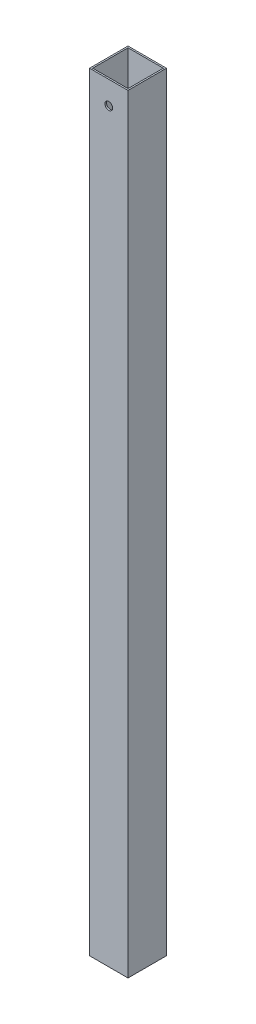
ISO-10303-21;
HEADER;
FILE_DESCRIPTION(('STEP AP214'),'2;1');
FILE_NAME('part.step','',(''),(''),'','','');
FILE_SCHEMA(('AUTOMOTIVE_DESIGN { 1 0 10303 214 1 1 1 1 }'));
ENDSEC;
DATA;
#1=APPLICATION_CONTEXT('core data for automotive mechanical design processes');
#2=APPLICATION_PROTOCOL_DEFINITION('international standard','automotive_design',2000,#1);
#3=PRODUCT_CONTEXT('',#1,'mechanical');
#4=PRODUCT('Part','Part','',(#3));
#5=PRODUCT_RELATED_PRODUCT_CATEGORY('part','',(#4));
#6=PRODUCT_DEFINITION_FORMATION('','',#4);
#7=PRODUCT_DEFINITION_CONTEXT('part definition',#1,'design');
#8=PRODUCT_DEFINITION('design','',#6,#7);
#9=PRODUCT_DEFINITION_SHAPE('','',#8);
#10=(LENGTH_UNIT() NAMED_UNIT(*) SI_UNIT(.MILLI.,.METRE.));
#11=(NAMED_UNIT(*) PLANE_ANGLE_UNIT() SI_UNIT($,.RADIAN.));
#12=(NAMED_UNIT(*) SI_UNIT($,.STERADIAN.) SOLID_ANGLE_UNIT());
#13=UNCERTAINTY_MEASURE_WITH_UNIT(LENGTH_MEASURE(1.E-05),#10,'distance_accuracy_value','');
#14=(GEOMETRIC_REPRESENTATION_CONTEXT(3) GLOBAL_UNCERTAINTY_ASSIGNED_CONTEXT((#13)) GLOBAL_UNIT_ASSIGNED_CONTEXT((#10,
#11,#12)) REPRESENTATION_CONTEXT('',''));
#15=CARTESIAN_POINT('',(0.,0.,0.));
#16=DIRECTION('',(0.,0.,1.));
#17=DIRECTION('',(1.,0.,0.));
#18=AXIS2_PLACEMENT_3D('',#15,#16,#17);
#19=CARTESIAN_POINT('',(0.,1000.,0.));
#20=DIRECTION('',(0.,1.,0.));
#21=DIRECTION('',(0.,0.,1.));
#22=AXIS2_PLACEMENT_3D('',#19,#20,#21);
#23=PLANE('',#22);
#24=DIRECTION('',(0.,0.,-1.));
#25=VECTOR('',#24,1.);
#26=CARTESIAN_POINT('',(25.,1000.,-25.));
#27=LINE('',#26,#25);
#28=CARTESIAN_POINT('',(25.,1000.,25.));
#29=VERTEX_POINT('',#28);
#30=CARTESIAN_POINT('',(25.,1000.,-25.));
#31=VERTEX_POINT('',#30);
#32=EDGE_CURVE('E137',#29,#31,#27,.T.);
#33=ORIENTED_EDGE('',*,*,#32,.T.);
#34=DIRECTION('',(-1.,0.,0.));
#35=VECTOR('',#34,1.);
#36=CARTESIAN_POINT('',(-25.,1000.,-25.));
#37=LINE('',#36,#35);
#38=CARTESIAN_POINT('',(-25.,1000.,-25.));
#39=VERTEX_POINT('',#38);
#40=EDGE_CURVE('E140',#31,#39,#37,.T.);
#41=ORIENTED_EDGE('',*,*,#40,.T.);
#42=DIRECTION('',(0.,0.,1.));
#43=VECTOR('',#42,1.);
#44=CARTESIAN_POINT('',(-25.,1000.,-25.));
#45=LINE('',#44,#43);
#46=CARTESIAN_POINT('',(-25.,1000.,25.));
#47=VERTEX_POINT('',#46);
#48=EDGE_CURVE('E143',#39,#47,#45,.T.);
#49=ORIENTED_EDGE('',*,*,#48,.T.);
#50=DIRECTION('',(1.,0.,0.));
#51=VECTOR('',#50,1.);
#52=CARTESIAN_POINT('',(-25.,1000.,25.));
#53=LINE('',#52,#51);
#54=EDGE_CURVE('E145',#47,#29,#53,.T.);
#55=ORIENTED_EDGE('',*,*,#54,.T.);
#56=EDGE_LOOP('',(#33,#41,#49,#55));
#57=FACE_BOUND('',#56,.T.);
#58=DIRECTION('',(-1.,0.,0.));
#59=VECTOR('',#58,1.);
#60=CARTESIAN_POINT('',(-23.,1000.,-23.));
#61=LINE('',#60,#59);
#62=CARTESIAN_POINT('',(23.,1000.,-23.));
#63=VERTEX_POINT('',#62);
#64=CARTESIAN_POINT('',(-23.,1000.,-23.));
#65=VERTEX_POINT('',#64);
#66=EDGE_CURVE('E107',#63,#65,#61,.T.);
#67=ORIENTED_EDGE('',*,*,#66,.F.);
#68=DIRECTION('',(0.,0.,-1.));
#69=VECTOR('',#68,1.);
#70=CARTESIAN_POINT('',(23.,1000.,-23.));
#71=LINE('',#70,#69);
#72=CARTESIAN_POINT('',(23.,1000.,23.));
#73=VERTEX_POINT('',#72);
#74=EDGE_CURVE('E99',#73,#63,#71,.T.);
#75=ORIENTED_EDGE('',*,*,#74,.F.);
#76=DIRECTION('',(1.,0.,0.));
#77=VECTOR('',#76,1.);
#78=CARTESIAN_POINT('',(-23.,1000.,23.));
#79=LINE('',#78,#77);
#80=CARTESIAN_POINT('',(-23.,1000.,23.));
#81=VERTEX_POINT('',#80);
#82=EDGE_CURVE('E121',#81,#73,#79,.T.);
#83=ORIENTED_EDGE('',*,*,#82,.F.);
#84=DIRECTION('',(0.,0.,1.));
#85=VECTOR('',#84,1.);
#86=CARTESIAN_POINT('',(-23.,1000.,-23.));
#87=LINE('',#86,#85);
#88=EDGE_CURVE('E119',#65,#81,#87,.T.);
#89=ORIENTED_EDGE('',*,*,#88,.F.);
#90=EDGE_LOOP('',(#67,#75,#83,#89));
#91=FACE_BOUND('',#90,.T.);
#92=ADVANCED_FACE('F33',(#57,#91),#23,.T.);
#93=CARTESIAN_POINT('',(0.,0.,0.));
#94=DIRECTION('',(0.,1.,0.));
#95=DIRECTION('',(0.,0.,1.));
#96=AXIS2_PLACEMENT_3D('',#93,#94,#95);
#97=PLANE('',#96);
#98=DIRECTION('',(0.,0.,-1.));
#99=VECTOR('',#98,1.);
#100=CARTESIAN_POINT('',(25.,0.,-25.));
#101=LINE('',#100,#99);
#102=CARTESIAN_POINT('',(25.,0.,25.));
#103=VERTEX_POINT('',#102);
#104=CARTESIAN_POINT('',(25.,0.,-25.));
#105=VERTEX_POINT('',#104);
#106=EDGE_CURVE('E115',#103,#105,#101,.T.);
#107=ORIENTED_EDGE('',*,*,#106,.F.);
#108=DIRECTION('',(1.,0.,0.));
#109=VECTOR('',#108,1.);
#110=CARTESIAN_POINT('',(-25.,0.,25.));
#111=LINE('',#110,#109);
#112=CARTESIAN_POINT('',(-25.,0.,25.));
#113=VERTEX_POINT('',#112);
#114=EDGE_CURVE('E141',#113,#103,#111,.T.);
#115=ORIENTED_EDGE('',*,*,#114,.F.);
#116=DIRECTION('',(0.,0.,1.));
#117=VECTOR('',#116,1.);
#118=CARTESIAN_POINT('',(-25.,0.,-25.));
#119=LINE('',#118,#117);
#120=CARTESIAN_POINT('',(-25.,0.,-25.));
#121=VERTEX_POINT('',#120);
#122=EDGE_CURVE('E152',#121,#113,#119,.T.);
#123=ORIENTED_EDGE('',*,*,#122,.F.);
#124=DIRECTION('',(-1.,0.,0.));
#125=VECTOR('',#124,1.);
#126=CARTESIAN_POINT('',(-25.,0.,-25.));
#127=LINE('',#126,#125);
#128=EDGE_CURVE('E150',#105,#121,#127,.T.);
#129=ORIENTED_EDGE('',*,*,#128,.F.);
#130=EDGE_LOOP('',(#107,#115,#123,#129));
#131=FACE_BOUND('',#130,.T.);
#132=DIRECTION('',(0.,0.,-1.));
#133=VECTOR('',#132,1.);
#134=CARTESIAN_POINT('',(23.,0.,-23.));
#135=LINE('',#134,#133);
#136=CARTESIAN_POINT('',(23.,0.,23.));
#137=VERTEX_POINT('',#136);
#138=CARTESIAN_POINT('',(23.,0.,-23.));
#139=VERTEX_POINT('',#138);
#140=EDGE_CURVE('E57',#137,#139,#135,.T.);
#141=ORIENTED_EDGE('',*,*,#140,.T.);
#142=DIRECTION('',(-1.,0.,0.));
#143=VECTOR('',#142,1.);
#144=CARTESIAN_POINT('',(-23.,0.,-23.));
#145=LINE('',#144,#143);
#146=CARTESIAN_POINT('',(-23.,0.,-23.));
#147=VERTEX_POINT('',#146);
#148=EDGE_CURVE('E114',#139,#147,#145,.T.);
#149=ORIENTED_EDGE('',*,*,#148,.T.);
#150=DIRECTION('',(0.,0.,1.));
#151=VECTOR('',#150,1.);
#152=CARTESIAN_POINT('',(-23.,0.,-23.));
#153=LINE('',#152,#151);
#154=CARTESIAN_POINT('',(-23.,0.,23.));
#155=VERTEX_POINT('',#154);
#156=EDGE_CURVE('E129',#147,#155,#153,.T.);
#157=ORIENTED_EDGE('',*,*,#156,.T.);
#158=DIRECTION('',(1.,0.,0.));
#159=VECTOR('',#158,1.);
#160=CARTESIAN_POINT('',(-23.,0.,23.));
#161=LINE('',#160,#159);
#162=EDGE_CURVE('E108',#155,#137,#161,.T.);
#163=ORIENTED_EDGE('',*,*,#162,.T.);
#164=EDGE_LOOP('',(#141,#149,#157,#163));
#165=FACE_BOUND('',#164,.T.);
#166=ADVANCED_FACE('F171',(#131,#165),#97,.F.);
#167=CARTESIAN_POINT('',(25.,1000.,-25.));
#168=DIRECTION('',(-1.,0.,0.));
#169=DIRECTION('',(0.,0.,1.));
#170=AXIS2_PLACEMENT_3D('',#167,#168,#169);
#171=PLANE('',#170);
#172=ORIENTED_EDGE('',*,*,#106,.T.);
#173=DIRECTION('',(0.,-1.,0.));
#174=VECTOR('',#173,1.);
#175=CARTESIAN_POINT('',(25.,1000.,-25.));
#176=LINE('',#175,#174);
#177=EDGE_CURVE('E11',#31,#105,#176,.T.);
#178=ORIENTED_EDGE('',*,*,#177,.F.);
#179=ORIENTED_EDGE('',*,*,#32,.F.);
#180=DIRECTION('',(0.,-1.,0.));
#181=VECTOR('',#180,1.);
#182=CARTESIAN_POINT('',(25.,1000.,25.));
#183=LINE('',#182,#181);
#184=EDGE_CURVE('E147',#29,#103,#183,.T.);
#185=ORIENTED_EDGE('',*,*,#184,.T.);
#186=EDGE_LOOP('',(#172,#178,#179,#185));
#187=FACE_BOUND('',#186,.T.);
#188=ADVANCED_FACE('F35',(#187),#171,.F.);
#189=CARTESIAN_POINT('',(-25.,1000.,-25.));
#190=DIRECTION('',(0.,0.,1.));
#191=DIRECTION('',(1.,0.,0.));
#192=AXIS2_PLACEMENT_3D('',#189,#190,#191);
#193=PLANE('',#192);
#194=CARTESIAN_POINT('',(0.,970.,-25.));
#195=DIRECTION('',(0.,0.,1.));
#196=DIRECTION('',(1.,0.,0.));
#197=AXIS2_PLACEMENT_3D('',#194,#195,#196);
#198=CIRCLE('',#197,5.);
#199=CARTESIAN_POINT('',(5.,970.,-25.));
#200=VERTEX_POINT('',#199);
#201=EDGE_CURVE('E211',#200,#200,#198,.T.);
#202=ORIENTED_EDGE('',*,*,#201,.T.);
#203=EDGE_LOOP('',(#202));
#204=FACE_BOUND('',#203,.T.);
#205=ORIENTED_EDGE('',*,*,#128,.T.);
#206=DIRECTION('',(0.,-1.,0.));
#207=VECTOR('',#206,1.);
#208=CARTESIAN_POINT('',(-25.,1000.,-25.));
#209=LINE('',#208,#207);
#210=EDGE_CURVE('E42',#39,#121,#209,.T.);
#211=ORIENTED_EDGE('',*,*,#210,.F.);
#212=ORIENTED_EDGE('',*,*,#40,.F.);
#213=ORIENTED_EDGE('',*,*,#177,.T.);
#214=EDGE_LOOP('',(#205,#211,#212,#213));
#215=FACE_BOUND('',#214,.T.);
#216=ADVANCED_FACE('F181',(#204,#215),#193,.F.);
#217=CARTESIAN_POINT('',(-25.,1000.,-25.));
#218=DIRECTION('',(1.,0.,0.));
#219=DIRECTION('',(0.,0.,-1.));
#220=AXIS2_PLACEMENT_3D('',#217,#218,#219);
#221=PLANE('',#220);
#222=ORIENTED_EDGE('',*,*,#122,.T.);
#223=DIRECTION('',(0.,-1.,0.));
#224=VECTOR('',#223,1.);
#225=CARTESIAN_POINT('',(-25.,1000.,25.));
#226=LINE('',#225,#224);
#227=EDGE_CURVE('E157',#47,#113,#226,.T.);
#228=ORIENTED_EDGE('',*,*,#227,.F.);
#229=ORIENTED_EDGE('',*,*,#48,.F.);
#230=ORIENTED_EDGE('',*,*,#210,.T.);
#231=EDGE_LOOP('',(#222,#228,#229,#230));
#232=FACE_BOUND('',#231,.T.);
#233=ADVANCED_FACE('F165',(#232),#221,.F.);
#234=CARTESIAN_POINT('',(-25.,1000.,25.));
#235=DIRECTION('',(0.,0.,-1.));
#236=DIRECTION('',(-1.,0.,0.));
#237=AXIS2_PLACEMENT_3D('',#234,#235,#236);
#238=PLANE('',#237);
#239=CARTESIAN_POINT('',(0.,970.,25.));
#240=DIRECTION('',(0.,0.,-1.));
#241=DIRECTION('',(-1.,0.,0.));
#242=AXIS2_PLACEMENT_3D('',#239,#240,#241);
#243=CIRCLE('',#242,5.);
#244=CARTESIAN_POINT('',(-5.,970.,25.));
#245=VERTEX_POINT('',#244);
#246=EDGE_CURVE('E127',#245,#245,#243,.T.);
#247=ORIENTED_EDGE('',*,*,#246,.T.);
#248=EDGE_LOOP('',(#247));
#249=FACE_BOUND('',#248,.T.);
#250=ORIENTED_EDGE('',*,*,#114,.T.);
#251=ORIENTED_EDGE('',*,*,#184,.F.);
#252=ORIENTED_EDGE('',*,*,#54,.F.);
#253=ORIENTED_EDGE('',*,*,#227,.T.);
#254=EDGE_LOOP('',(#250,#251,#252,#253));
#255=FACE_BOUND('',#254,.T.);
#256=ADVANCED_FACE('F175',(#249,#255),#238,.F.);
#257=CARTESIAN_POINT('',(23.,1000.,-23.));
#258=DIRECTION('',(-1.,0.,0.));
#259=DIRECTION('',(0.,0.,1.));
#260=AXIS2_PLACEMENT_3D('',#257,#258,#259);
#261=PLANE('',#260);
#262=ORIENTED_EDGE('',*,*,#140,.F.);
#263=DIRECTION('',(0.,-1.,0.));
#264=VECTOR('',#263,1.);
#265=CARTESIAN_POINT('',(23.,1000.,23.));
#266=LINE('',#265,#264);
#267=EDGE_CURVE('E103',#73,#137,#266,.T.);
#268=ORIENTED_EDGE('',*,*,#267,.F.);
#269=ORIENTED_EDGE('',*,*,#74,.T.);
#270=DIRECTION('',(0.,-1.,0.));
#271=VECTOR('',#270,1.);
#272=CARTESIAN_POINT('',(23.,1000.,-23.));
#273=LINE('',#272,#271);
#274=EDGE_CURVE('E102',#63,#139,#273,.T.);
#275=ORIENTED_EDGE('',*,*,#274,.T.);
#276=EDGE_LOOP('',(#262,#268,#269,#275));
#277=FACE_BOUND('',#276,.T.);
#278=ADVANCED_FACE('F101',(#277),#261,.T.);
#279=CARTESIAN_POINT('',(-23.,1000.,-23.));
#280=DIRECTION('',(0.,0.,1.));
#281=DIRECTION('',(1.,0.,0.));
#282=AXIS2_PLACEMENT_3D('',#279,#280,#281);
#283=PLANE('',#282);
#284=CARTESIAN_POINT('',(0.,970.,-23.));
#285=DIRECTION('',(0.,0.,1.));
#286=DIRECTION('',(1.,0.,0.));
#287=AXIS2_PLACEMENT_3D('',#284,#285,#286);
#288=CIRCLE('',#287,5.);
#289=CARTESIAN_POINT('',(5.,970.,-23.));
#290=VERTEX_POINT('',#289);
#291=EDGE_CURVE('E207',#290,#290,#288,.T.);
#292=ORIENTED_EDGE('',*,*,#291,.F.);
#293=EDGE_LOOP('',(#292));
#294=FACE_BOUND('',#293,.T.);
#295=ORIENTED_EDGE('',*,*,#148,.F.);
#296=ORIENTED_EDGE('',*,*,#274,.F.);
#297=ORIENTED_EDGE('',*,*,#66,.T.);
#298=DIRECTION('',(0.,-1.,0.));
#299=VECTOR('',#298,1.);
#300=CARTESIAN_POINT('',(-23.,1000.,-23.));
#301=LINE('',#300,#299);
#302=EDGE_CURVE('E116',#65,#147,#301,.T.);
#303=ORIENTED_EDGE('',*,*,#302,.T.);
#304=EDGE_LOOP('',(#295,#296,#297,#303));
#305=FACE_BOUND('',#304,.T.);
#306=ADVANCED_FACE('F111',(#294,#305),#283,.T.);
#307=CARTESIAN_POINT('',(-23.,1000.,-23.));
#308=DIRECTION('',(1.,0.,0.));
#309=DIRECTION('',(0.,0.,-1.));
#310=AXIS2_PLACEMENT_3D('',#307,#308,#309);
#311=PLANE('',#310);
#312=ORIENTED_EDGE('',*,*,#156,.F.);
#313=ORIENTED_EDGE('',*,*,#302,.F.);
#314=ORIENTED_EDGE('',*,*,#88,.T.);
#315=DIRECTION('',(0.,-1.,0.));
#316=VECTOR('',#315,1.);
#317=CARTESIAN_POINT('',(-23.,1000.,23.));
#318=LINE('',#317,#316);
#319=EDGE_CURVE('E49',#81,#155,#318,.T.);
#320=ORIENTED_EDGE('',*,*,#319,.T.);
#321=EDGE_LOOP('',(#312,#313,#314,#320));
#322=FACE_BOUND('',#321,.T.);
#323=ADVANCED_FACE('F220',(#322),#311,.T.);
#324=CARTESIAN_POINT('',(-23.,1000.,23.));
#325=DIRECTION('',(0.,0.,-1.));
#326=DIRECTION('',(-1.,0.,0.));
#327=AXIS2_PLACEMENT_3D('',#324,#325,#326);
#328=PLANE('',#327);
#329=CARTESIAN_POINT('',(0.,970.,23.));
#330=DIRECTION('',(0.,0.,-1.));
#331=DIRECTION('',(-1.,0.,0.));
#332=AXIS2_PLACEMENT_3D('',#329,#330,#331);
#333=CIRCLE('',#332,5.);
#334=CARTESIAN_POINT('',(-5.,970.,23.));
#335=VERTEX_POINT('',#334);
#336=EDGE_CURVE('E37',#335,#335,#333,.T.);
#337=ORIENTED_EDGE('',*,*,#336,.F.);
#338=EDGE_LOOP('',(#337));
#339=FACE_BOUND('',#338,.T.);
#340=ORIENTED_EDGE('',*,*,#162,.F.);
#341=ORIENTED_EDGE('',*,*,#319,.F.);
#342=ORIENTED_EDGE('',*,*,#82,.T.);
#343=ORIENTED_EDGE('',*,*,#267,.T.);
#344=EDGE_LOOP('',(#340,#341,#342,#343));
#345=FACE_BOUND('',#344,.T.);
#346=ADVANCED_FACE('F218',(#339,#345),#328,.T.);
#347=CARTESIAN_POINT('',(0.,970.,-25.));
#348=DIRECTION('',(0.,0.,1.));
#349=DIRECTION('',(1.,0.,0.));
#350=AXIS2_PLACEMENT_3D('',#347,#348,#349);
#351=CYLINDRICAL_SURFACE('',#350,5.);
#352=ORIENTED_EDGE('',*,*,#336,.T.);
#353=EDGE_LOOP('',(#352));
#354=FACE_BOUND('',#353,.T.);
#355=ORIENTED_EDGE('',*,*,#246,.F.);
#356=EDGE_LOOP('',(#355));
#357=FACE_BOUND('',#356,.T.);
#358=ADVANCED_FACE('F216',(#354,#357),#351,.F.);
#359=ORIENTED_EDGE('',*,*,#291,.T.);
#360=EDGE_LOOP('',(#359));
#361=FACE_BOUND('',#360,.T.);
#362=ORIENTED_EDGE('',*,*,#201,.F.);
#363=EDGE_LOOP('',(#362));
#364=FACE_BOUND('',#363,.T.);
#365=ADVANCED_FACE('F232',(#361,#364),#351,.F.);
#366=CLOSED_SHELL('',(#92,#166,#188,#216,#233,#256,#278,#306,#323,#346,#358,#365));
#367=MANIFOLD_SOLID_BREP('B2',#366);
#368=ADVANCED_BREP_SHAPE_REPRESENTATION('',(#18,#367),#14);
#369=SHAPE_DEFINITION_REPRESENTATION(#9,#368);
ENDSEC;
END-ISO-10303-21;
